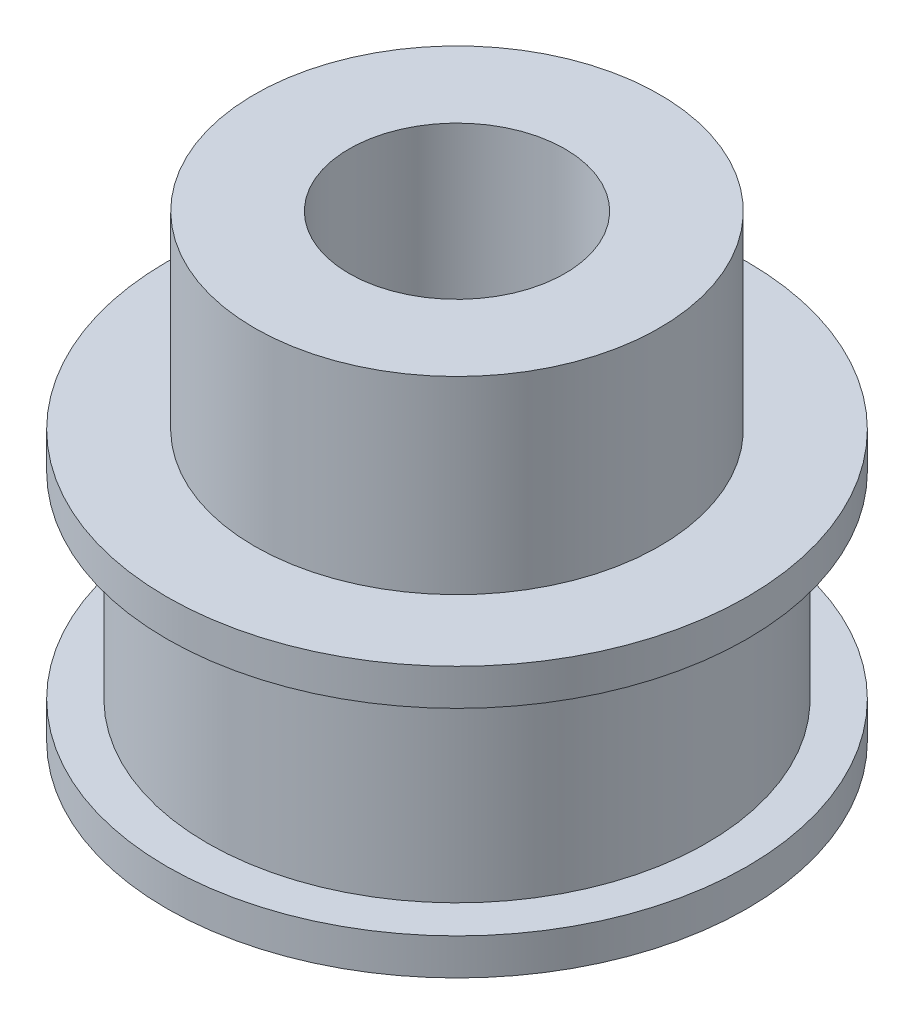
ISO-10303-21;
HEADER;
FILE_DESCRIPTION(('STEP AP214'),'2;1');
FILE_NAME('part.step','',(''),(''),'','','');
FILE_SCHEMA(('AUTOMOTIVE_DESIGN { 1 0 10303 214 1 1 1 1 }'));
ENDSEC;
DATA;
#1=APPLICATION_CONTEXT('core data for automotive mechanical design processes');
#2=APPLICATION_PROTOCOL_DEFINITION('international standard','automotive_design',2000,#1);
#3=PRODUCT_CONTEXT('',#1,'mechanical');
#4=PRODUCT('Part','Part','',(#3));
#5=PRODUCT_RELATED_PRODUCT_CATEGORY('part','',(#4));
#6=PRODUCT_DEFINITION_FORMATION('','',#4);
#7=PRODUCT_DEFINITION_CONTEXT('part definition',#1,'design');
#8=PRODUCT_DEFINITION('design','',#6,#7);
#9=PRODUCT_DEFINITION_SHAPE('','',#8);
#10=(LENGTH_UNIT() NAMED_UNIT(*) SI_UNIT(.MILLI.,.METRE.));
#11=(NAMED_UNIT(*) PLANE_ANGLE_UNIT() SI_UNIT($,.RADIAN.));
#12=(NAMED_UNIT(*) SI_UNIT($,.STERADIAN.) SOLID_ANGLE_UNIT());
#13=UNCERTAINTY_MEASURE_WITH_UNIT(LENGTH_MEASURE(1.E-05),#10,'distance_accuracy_value','');
#14=(GEOMETRIC_REPRESENTATION_CONTEXT(3) GLOBAL_UNCERTAINTY_ASSIGNED_CONTEXT((#13)) GLOBAL_UNIT_ASSIGNED_CONTEXT((#10,
#11,#12)) REPRESENTATION_CONTEXT('',''));
#15=CARTESIAN_POINT('',(0.,0.,0.));
#16=DIRECTION('',(0.,0.,1.));
#17=DIRECTION('',(1.,0.,0.));
#18=AXIS2_PLACEMENT_3D('',#15,#16,#17);
#19=CARTESIAN_POINT('',(0.,1.35,0.));
#20=DIRECTION('',(0.,-1.,0.));
#21=DIRECTION('',(0.,0.,-1.));
#22=AXIS2_PLACEMENT_3D('',#19,#20,#21);
#23=CYLINDRICAL_SURFACE('',#22,10.75);
#24=CARTESIAN_POINT('',(0.,1.35,0.));
#25=DIRECTION('',(0.,1.,0.));
#26=DIRECTION('',(0.,0.,1.));
#27=AXIS2_PLACEMENT_3D('',#24,#25,#26);
#28=CIRCLE('',#27,10.75);
#29=CARTESIAN_POINT('',(0.,1.35,-10.75));
#30=VERTEX_POINT('',#29);
#31=EDGE_CURVE('E50',#30,#30,#28,.T.);
#32=CARTESIAN_POINT('',(0.,0.,0.));
#33=DIRECTION('',(0.,1.,0.));
#34=DIRECTION('',(0.,0.,1.));
#35=AXIS2_PLACEMENT_3D('',#32,#33,#34);
#36=CIRCLE('',#35,10.75);
#37=CARTESIAN_POINT('',(0.,0.,-10.75));
#38=VERTEX_POINT('',#37);
#39=EDGE_CURVE('E41',#38,#38,#36,.T.);
#40=CARTESIAN_POINT('',(0.,1.35,-10.75));
#41=CARTESIAN_POINT('',(0.,1.3359375,-10.75));
#42=CARTESIAN_POINT('',(0.,1.321875,-10.75));
#43=CARTESIAN_POINT('',(0.,1.29375,-10.75));
#44=CARTESIAN_POINT('',(0.,1.2796875,-10.75));
#45=CARTESIAN_POINT('',(0.,1.2515625,-10.75));
#46=CARTESIAN_POINT('',(0.,1.2375,-10.75));
#47=CARTESIAN_POINT('',(0.,1.209375,-10.75));
#48=CARTESIAN_POINT('',(0.,1.1953125,-10.75));
#49=CARTESIAN_POINT('',(0.,1.1671875,-10.75));
#50=CARTESIAN_POINT('',(0.,1.153125,-10.75));
#51=CARTESIAN_POINT('',(0.,1.125,-10.75));
#52=CARTESIAN_POINT('',(0.,1.1109375,-10.75));
#53=CARTESIAN_POINT('',(0.,1.0828125,-10.75));
#54=CARTESIAN_POINT('',(0.,1.06875,-10.75));
#55=CARTESIAN_POINT('',(0.,1.040625,-10.75));
#56=CARTESIAN_POINT('',(0.,1.0265625,-10.75));
#57=CARTESIAN_POINT('',(0.,0.9984375,-10.75));
#58=CARTESIAN_POINT('',(0.,0.984375,-10.75));
#59=CARTESIAN_POINT('',(0.,0.95625,-10.75));
#60=CARTESIAN_POINT('',(0.,0.9421875,-10.75));
#61=CARTESIAN_POINT('',(0.,0.9140625,-10.75));
#62=CARTESIAN_POINT('',(0.,0.9,-10.75));
#63=CARTESIAN_POINT('',(0.,0.871875,-10.75));
#64=CARTESIAN_POINT('',(0.,0.8578125,-10.75));
#65=CARTESIAN_POINT('',(0.,0.8296875,-10.75));
#66=CARTESIAN_POINT('',(0.,0.815625,-10.75));
#67=CARTESIAN_POINT('',(0.,0.7875,-10.75));
#68=CARTESIAN_POINT('',(0.,0.7734375,-10.75));
#69=CARTESIAN_POINT('',(0.,0.7453125,-10.75));
#70=CARTESIAN_POINT('',(0.,0.73125,-10.75));
#71=CARTESIAN_POINT('',(0.,0.703125,-10.75));
#72=CARTESIAN_POINT('',(0.,0.6890625,-10.75));
#73=CARTESIAN_POINT('',(0.,0.6609375,-10.75));
#74=CARTESIAN_POINT('',(0.,0.646875,-10.75));
#75=CARTESIAN_POINT('',(0.,0.61875,-10.75));
#76=CARTESIAN_POINT('',(0.,0.6046875,-10.75));
#77=CARTESIAN_POINT('',(0.,0.5765625,-10.75));
#78=CARTESIAN_POINT('',(0.,0.5625,-10.75));
#79=CARTESIAN_POINT('',(0.,0.534375,-10.75));
#80=CARTESIAN_POINT('',(0.,0.5203125,-10.75));
#81=CARTESIAN_POINT('',(0.,0.4921875,-10.75));
#82=CARTESIAN_POINT('',(0.,0.478125,-10.75));
#83=CARTESIAN_POINT('',(0.,0.45,-10.75));
#84=CARTESIAN_POINT('',(0.,0.4359375,-10.75));
#85=CARTESIAN_POINT('',(0.,0.4078125,-10.75));
#86=CARTESIAN_POINT('',(0.,0.39375,-10.75));
#87=CARTESIAN_POINT('',(0.,0.365625,-10.75));
#88=CARTESIAN_POINT('',(0.,0.3515625,-10.75));
#89=CARTESIAN_POINT('',(0.,0.3234375,-10.75));
#90=CARTESIAN_POINT('',(0.,0.309375,-10.75));
#91=CARTESIAN_POINT('',(0.,0.28125,-10.75));
#92=CARTESIAN_POINT('',(0.,0.2671875,-10.75));
#93=CARTESIAN_POINT('',(0.,0.2390625,-10.75));
#94=CARTESIAN_POINT('',(0.,0.225,-10.75));
#95=CARTESIAN_POINT('',(0.,0.196875,-10.75));
#96=CARTESIAN_POINT('',(0.,0.1828125,-10.75));
#97=CARTESIAN_POINT('',(0.,0.1546875,-10.75));
#98=CARTESIAN_POINT('',(0.,0.140625,-10.75));
#99=CARTESIAN_POINT('',(0.,0.1125,-10.75));
#100=CARTESIAN_POINT('',(0.,0.0984374999999998,-10.75));
#101=CARTESIAN_POINT('',(0.,0.0703124999999998,-10.75));
#102=CARTESIAN_POINT('',(0.,0.0562499999999999,-10.75));
#103=CARTESIAN_POINT('',(0.,0.0281249999999999,-10.75));
#104=CARTESIAN_POINT('',(0.,0.0140624999999998,-10.75));
#105=CARTESIAN_POINT('',(0.,0.,-10.75));
#106=B_SPLINE_CURVE_WITH_KNOTS('',3,(#40,#41,#42,#43,#44,#45,#46,#47,#48,#49,#50,#51,#52,#53,
#54,#55,#56,#57,#58,#59,#60,#61,#62,#63,#64,#65,#66,#67,#68,#69,#70,#71,#72,#73,#74,#75,#76,#77,
#78,#79,#80,#81,#82,#83,#84,#85,#86,#87,#88,#89,#90,#91,#92,#93,#94,#95,#96,#97,#98,#99,#100,
#101,#102,#103,#104,#105),.UNSPECIFIED.,.F.,.F.,(4,2,2,2,2,2,2,2,2,2,2,2,2,2,2,2,2,2,2,2,2,2,2,
2,2,2,2,2,2,2,2,2,4),(0.,0.0421875000000001,0.084375,0.1265625,0.16875,0.2109375,0.253125,
0.2953125,0.3375,0.3796875,0.421875,0.4640625,0.50625,0.5484375,0.590625,0.6328125,0.675,
0.7171875,0.759375,0.8015625,0.84375,0.8859375,0.928125,0.9703125,1.0125,1.0546875,1.096875,
1.1390625,1.18125,1.2234375,1.265625,1.3078125,1.35),.UNSPECIFIED.);
#107=EDGE_CURVE('BSEAM38',#30,#38,#106,.T.);
#108=ORIENTED_EDGE('',*,*,#31,.F.);
#109=ORIENTED_EDGE('',*,*,#39,.T.);
#110=ORIENTED_EDGE('',*,*,#107,.T.);
#111=ORIENTED_EDGE('',*,*,#107,.F.);
#112=EDGE_LOOP('',(#108,#110,#109,#111));
#113=FACE_BOUND('',#112,.T.);
#114=ADVANCED_FACE('F38',(#113),#23,.T.);
#115=CARTESIAN_POINT('',(0.,1.35,0.));
#116=DIRECTION('',(0.,1.,0.));
#117=DIRECTION('',(0.,0.,1.));
#118=AXIS2_PLACEMENT_3D('',#115,#116,#117);
#119=PLANE('',#118);
#120=CARTESIAN_POINT('',(0.,1.35,0.));
#121=DIRECTION('',(0.,1.,0.));
#122=DIRECTION('',(0.,0.,1.));
#123=AXIS2_PLACEMENT_3D('',#120,#121,#122);
#124=CIRCLE('',#123,9.25);
#125=CARTESIAN_POINT('',(0.,1.35,9.25));
#126=VERTEX_POINT('',#125);
#127=EDGE_CURVE('E45',#126,#126,#124,.T.);
#128=ORIENTED_EDGE('',*,*,#127,.F.);
#129=EDGE_LOOP('',(#128));
#130=FACE_BOUND('',#129,.T.);
#131=ORIENTED_EDGE('',*,*,#31,.T.);
#132=EDGE_LOOP('',(#131));
#133=FACE_BOUND('',#132,.T.);
#134=ADVANCED_FACE('F74',(#130,#133),#119,.T.);
#135=CARTESIAN_POINT('',(0.,0.,0.));
#136=DIRECTION('',(0.,1.,0.));
#137=DIRECTION('',(0.,0.,1.));
#138=AXIS2_PLACEMENT_3D('',#135,#136,#137);
#139=PLANE('',#138);
#140=CARTESIAN_POINT('',(0.,0.,0.));
#141=DIRECTION('',(0.,-1.,0.));
#142=DIRECTION('',(0.,0.,-1.));
#143=AXIS2_PLACEMENT_3D('',#140,#141,#142);
#144=CIRCLE('',#143,4.);
#145=CARTESIAN_POINT('',(0.,0.,-4.));
#146=VERTEX_POINT('',#145);
#147=EDGE_CURVE('E172',#146,#146,#144,.T.);
#148=ORIENTED_EDGE('',*,*,#147,.F.);
#149=EDGE_LOOP('',(#148));
#150=FACE_BOUND('',#149,.T.);
#151=ORIENTED_EDGE('',*,*,#39,.F.);
#152=EDGE_LOOP('',(#151));
#153=FACE_BOUND('',#152,.T.);
#154=ADVANCED_FACE('F71',(#150,#153),#139,.F.);
#155=CARTESIAN_POINT('',(0.,8.65,0.));
#156=DIRECTION('',(0.,-1.,0.));
#157=DIRECTION('',(0.,0.,-1.));
#158=AXIS2_PLACEMENT_3D('',#155,#156,#157);
#159=CYLINDRICAL_SURFACE('',#158,9.25);
#160=CARTESIAN_POINT('',(0.,8.65,0.));
#161=DIRECTION('',(0.,1.,0.));
#162=DIRECTION('',(0.,0.,1.));
#163=AXIS2_PLACEMENT_3D('',#160,#161,#162);
#164=CIRCLE('',#163,9.25);
#165=CARTESIAN_POINT('',(0.,8.65,9.25));
#166=VERTEX_POINT('',#165);
#167=EDGE_CURVE('E59',#166,#166,#164,.T.);
#168=ORIENTED_EDGE('',*,*,#167,.F.);
#169=EDGE_LOOP('',(#168));
#170=FACE_BOUND('',#169,.T.);
#171=ORIENTED_EDGE('',*,*,#127,.T.);
#172=EDGE_LOOP('',(#171));
#173=FACE_BOUND('',#172,.T.);
#174=ADVANCED_FACE('F73',(#170,#173),#159,.T.);
#175=CARTESIAN_POINT('',(0.,10.,0.));
#176=DIRECTION('',(0.,-1.,0.));
#177=DIRECTION('',(0.,0.,-1.));
#178=AXIS2_PLACEMENT_3D('',#175,#176,#177);
#179=CYLINDRICAL_SURFACE('',#178,10.75);
#180=CARTESIAN_POINT('',(0.,10.,0.));
#181=DIRECTION('',(0.,1.,0.));
#182=DIRECTION('',(0.,0.,1.));
#183=AXIS2_PLACEMENT_3D('',#180,#181,#182);
#184=CIRCLE('',#183,10.75);
#185=CARTESIAN_POINT('',(0.,10.,-10.75));
#186=VERTEX_POINT('',#185);
#187=EDGE_CURVE('E56',#186,#186,#184,.T.);
#188=CARTESIAN_POINT('',(0.,8.65,0.));
#189=DIRECTION('',(0.,1.,0.));
#190=DIRECTION('',(0.,0.,1.));
#191=AXIS2_PLACEMENT_3D('',#188,#189,#190);
#192=CIRCLE('',#191,10.75);
#193=CARTESIAN_POINT('',(0.,8.65,-10.75));
#194=VERTEX_POINT('',#193);
#195=EDGE_CURVE('E60',#194,#194,#192,.T.);
#196=CARTESIAN_POINT('',(0.,10.,-10.75));
#197=CARTESIAN_POINT('',(0.,9.9859375,-10.75));
#198=CARTESIAN_POINT('',(0.,9.971875,-10.75));
#199=CARTESIAN_POINT('',(0.,9.94375,-10.75));
#200=CARTESIAN_POINT('',(0.,9.9296875,-10.75));
#201=CARTESIAN_POINT('',(0.,9.9015625,-10.75));
#202=CARTESIAN_POINT('',(0.,9.8875,-10.75));
#203=CARTESIAN_POINT('',(0.,9.859375,-10.75));
#204=CARTESIAN_POINT('',(0.,9.8453125,-10.75));
#205=CARTESIAN_POINT('',(0.,9.8171875,-10.75));
#206=CARTESIAN_POINT('',(0.,9.803125,-10.75));
#207=CARTESIAN_POINT('',(0.,9.775,-10.75));
#208=CARTESIAN_POINT('',(0.,9.7609375,-10.75));
#209=CARTESIAN_POINT('',(0.,9.7328125,-10.75));
#210=CARTESIAN_POINT('',(0.,9.71875,-10.75));
#211=CARTESIAN_POINT('',(0.,9.690625,-10.75));
#212=CARTESIAN_POINT('',(0.,9.6765625,-10.75));
#213=CARTESIAN_POINT('',(0.,9.6484375,-10.75));
#214=CARTESIAN_POINT('',(0.,9.634375,-10.75));
#215=CARTESIAN_POINT('',(0.,9.60625,-10.75));
#216=CARTESIAN_POINT('',(0.,9.5921875,-10.75));
#217=CARTESIAN_POINT('',(0.,9.5640625,-10.75));
#218=CARTESIAN_POINT('',(0.,9.55,-10.75));
#219=CARTESIAN_POINT('',(0.,9.521875,-10.75));
#220=CARTESIAN_POINT('',(0.,9.5078125,-10.75));
#221=CARTESIAN_POINT('',(0.,9.4796875,-10.75));
#222=CARTESIAN_POINT('',(0.,9.465625,-10.75));
#223=CARTESIAN_POINT('',(0.,9.4375,-10.75));
#224=CARTESIAN_POINT('',(0.,9.4234375,-10.75));
#225=CARTESIAN_POINT('',(0.,9.3953125,-10.75));
#226=CARTESIAN_POINT('',(0.,9.38125,-10.75));
#227=CARTESIAN_POINT('',(0.,9.353125,-10.75));
#228=CARTESIAN_POINT('',(0.,9.3390625,-10.75));
#229=CARTESIAN_POINT('',(0.,9.3109375,-10.75));
#230=CARTESIAN_POINT('',(0.,9.296875,-10.75));
#231=CARTESIAN_POINT('',(0.,9.26875,-10.75));
#232=CARTESIAN_POINT('',(0.,9.2546875,-10.75));
#233=CARTESIAN_POINT('',(0.,9.2265625,-10.75));
#234=CARTESIAN_POINT('',(0.,9.2125,-10.75));
#235=CARTESIAN_POINT('',(0.,9.184375,-10.75));
#236=CARTESIAN_POINT('',(0.,9.1703125,-10.75));
#237=CARTESIAN_POINT('',(0.,9.1421875,-10.75));
#238=CARTESIAN_POINT('',(0.,9.128125,-10.75));
#239=CARTESIAN_POINT('',(0.,9.1,-10.75));
#240=CARTESIAN_POINT('',(0.,9.0859375,-10.75));
#241=CARTESIAN_POINT('',(0.,9.0578125,-10.75));
#242=CARTESIAN_POINT('',(0.,9.04375,-10.75));
#243=CARTESIAN_POINT('',(0.,9.015625,-10.75));
#244=CARTESIAN_POINT('',(0.,9.0015625,-10.75));
#245=CARTESIAN_POINT('',(0.,8.9734375,-10.75));
#246=CARTESIAN_POINT('',(0.,8.959375,-10.75));
#247=CARTESIAN_POINT('',(0.,8.93125,-10.75));
#248=CARTESIAN_POINT('',(0.,8.9171875,-10.75));
#249=CARTESIAN_POINT('',(0.,8.8890625,-10.75));
#250=CARTESIAN_POINT('',(0.,8.875,-10.75));
#251=CARTESIAN_POINT('',(0.,8.846875,-10.75));
#252=CARTESIAN_POINT('',(0.,8.8328125,-10.75));
#253=CARTESIAN_POINT('',(0.,8.8046875,-10.75));
#254=CARTESIAN_POINT('',(0.,8.790625,-10.75));
#255=CARTESIAN_POINT('',(0.,8.7625,-10.75));
#256=CARTESIAN_POINT('',(0.,8.7484375,-10.75));
#257=CARTESIAN_POINT('',(0.,8.7203125,-10.75));
#258=CARTESIAN_POINT('',(0.,8.70625,-10.75));
#259=CARTESIAN_POINT('',(0.,8.678125,-10.75));
#260=CARTESIAN_POINT('',(0.,8.6640625,-10.75));
#261=CARTESIAN_POINT('',(0.,8.65,-10.75));
#262=B_SPLINE_CURVE_WITH_KNOTS('',3,(#196,#197,#198,#199,#200,#201,#202,#203,#204,#205,#206,
#207,#208,#209,#210,#211,#212,#213,#214,#215,#216,#217,#218,#219,#220,#221,#222,#223,#224,#225,
#226,#227,#228,#229,#230,#231,#232,#233,#234,#235,#236,#237,#238,#239,#240,#241,#242,#243,#244,
#245,#246,#247,#248,#249,#250,#251,#252,#253,#254,#255,#256,#257,#258,#259,#260,#261),
.UNSPECIFIED.,.F.,.F.,(4,2,2,2,2,2,2,2,2,2,2,2,2,2,2,2,2,2,2,2,2,2,2,2,2,2,2,2,2,2,2,2,4),(0.,
0.0421875000000006,0.0843750000000011,0.126562500000002,0.168750000000001,0.210937500000001,
0.253125000000002,0.2953125,0.337500000000001,0.379687500000002,0.421875,0.464062500000001,
0.506250000000002,0.5484375,0.590625000000001,0.632812500000001,0.675,0.717187500000001,
0.759375000000001,0.8015625,0.843750000000001,0.885937500000001,0.928125000000002,
0.970312500000001,1.0125,1.0546875,1.096875,1.1390625,1.18125,1.2234375,1.265625,1.3078125,
1.35),.UNSPECIFIED.);
#263=EDGE_CURVE('BSEAM80',#186,#194,#262,.T.);
#264=ORIENTED_EDGE('',*,*,#187,.F.);
#265=ORIENTED_EDGE('',*,*,#195,.T.);
#266=ORIENTED_EDGE('',*,*,#263,.T.);
#267=ORIENTED_EDGE('',*,*,#263,.F.);
#268=EDGE_LOOP('',(#264,#266,#265,#267));
#269=FACE_BOUND('',#268,.T.);
#270=ADVANCED_FACE('F80',(#269),#179,.T.);
#271=CARTESIAN_POINT('',(0.,10.,0.));
#272=DIRECTION('',(0.,1.,0.));
#273=DIRECTION('',(0.,0.,1.));
#274=AXIS2_PLACEMENT_3D('',#271,#272,#273);
#275=PLANE('',#274);
#276=CARTESIAN_POINT('',(0.,10.,0.));
#277=DIRECTION('',(0.,1.,0.));
#278=DIRECTION('',(0.,0.,1.));
#279=AXIS2_PLACEMENT_3D('',#276,#277,#278);
#280=CIRCLE('',#279,7.5);
#281=CARTESIAN_POINT('',(0.,10.,7.5));
#282=VERTEX_POINT('',#281);
#283=EDGE_CURVE('E10',#282,#282,#280,.T.);
#284=ORIENTED_EDGE('',*,*,#283,.F.);
#285=EDGE_LOOP('',(#284));
#286=FACE_BOUND('',#285,.T.);
#287=ORIENTED_EDGE('',*,*,#187,.T.);
#288=EDGE_LOOP('',(#287));
#289=FACE_BOUND('',#288,.T.);
#290=ADVANCED_FACE('F110',(#286,#289),#275,.T.);
#291=CARTESIAN_POINT('',(0.,8.65,0.));
#292=DIRECTION('',(0.,1.,0.));
#293=DIRECTION('',(0.,0.,1.));
#294=AXIS2_PLACEMENT_3D('',#291,#292,#293);
#295=PLANE('',#294);
#296=ORIENTED_EDGE('',*,*,#167,.T.);
#297=EDGE_LOOP('',(#296));
#298=FACE_BOUND('',#297,.T.);
#299=ORIENTED_EDGE('',*,*,#195,.F.);
#300=EDGE_LOOP('',(#299));
#301=FACE_BOUND('',#300,.T.);
#302=ADVANCED_FACE('F118',(#298,#301),#295,.F.);
#303=CARTESIAN_POINT('',(0.,17.,0.));
#304=DIRECTION('',(0.,-1.,0.));
#305=DIRECTION('',(0.,0.,-1.));
#306=AXIS2_PLACEMENT_3D('',#303,#304,#305);
#307=CYLINDRICAL_SURFACE('',#306,7.5);
#308=CARTESIAN_POINT('',(0.,17.,0.));
#309=DIRECTION('',(0.,1.,0.));
#310=DIRECTION('',(0.,0.,1.));
#311=AXIS2_PLACEMENT_3D('',#308,#309,#310);
#312=CIRCLE('',#311,7.5);
#313=CARTESIAN_POINT('',(0.,17.,7.5));
#314=VERTEX_POINT('',#313);
#315=EDGE_CURVE('E54',#314,#314,#312,.T.);
#316=ORIENTED_EDGE('',*,*,#315,.F.);
#317=EDGE_LOOP('',(#316));
#318=FACE_BOUND('',#317,.T.);
#319=ORIENTED_EDGE('',*,*,#283,.T.);
#320=EDGE_LOOP('',(#319));
#321=FACE_BOUND('',#320,.T.);
#322=ADVANCED_FACE('F123',(#318,#321),#307,.T.);
#323=CARTESIAN_POINT('',(0.,17.,0.));
#324=DIRECTION('',(0.,1.,0.));
#325=DIRECTION('',(0.,0.,1.));
#326=AXIS2_PLACEMENT_3D('',#323,#324,#325);
#327=PLANE('',#326);
#328=CARTESIAN_POINT('',(0.,17.,0.));
#329=DIRECTION('',(0.,-1.,0.));
#330=DIRECTION('',(0.,0.,-1.));
#331=AXIS2_PLACEMENT_3D('',#328,#329,#330);
#332=CIRCLE('',#331,4.);
#333=CARTESIAN_POINT('',(0.,17.,-4.));
#334=VERTEX_POINT('',#333);
#335=EDGE_CURVE('E170',#334,#334,#332,.T.);
#336=ORIENTED_EDGE('',*,*,#335,.T.);
#337=EDGE_LOOP('',(#336));
#338=FACE_BOUND('',#337,.T.);
#339=ORIENTED_EDGE('',*,*,#315,.T.);
#340=EDGE_LOOP('',(#339));
#341=FACE_BOUND('',#340,.T.);
#342=ADVANCED_FACE('F139',(#338,#341),#327,.T.);
#343=CARTESIAN_POINT('',(0.,17.,0.));
#344=DIRECTION('',(0.,-1.,0.));
#345=DIRECTION('',(0.,0.,-1.));
#346=AXIS2_PLACEMENT_3D('',#343,#344,#345);
#347=CYLINDRICAL_SURFACE('',#346,4.);
#348=ORIENTED_EDGE('',*,*,#335,.F.);
#349=EDGE_LOOP('',(#348));
#350=FACE_BOUND('',#349,.T.);
#351=ORIENTED_EDGE('',*,*,#147,.T.);
#352=EDGE_LOOP('',(#351));
#353=FACE_BOUND('',#352,.T.);
#354=ADVANCED_FACE('F153',(#350,#353),#347,.F.);
#355=CLOSED_SHELL('',(#114,#134,#154,#174,#270,#290,#302,#322,#342,#354));
#356=MANIFOLD_SOLID_BREP('B2',#355);
#357=ADVANCED_BREP_SHAPE_REPRESENTATION('',(#18,#356),#14);
#358=SHAPE_DEFINITION_REPRESENTATION(#9,#357);
ENDSEC;
END-ISO-10303-21;
